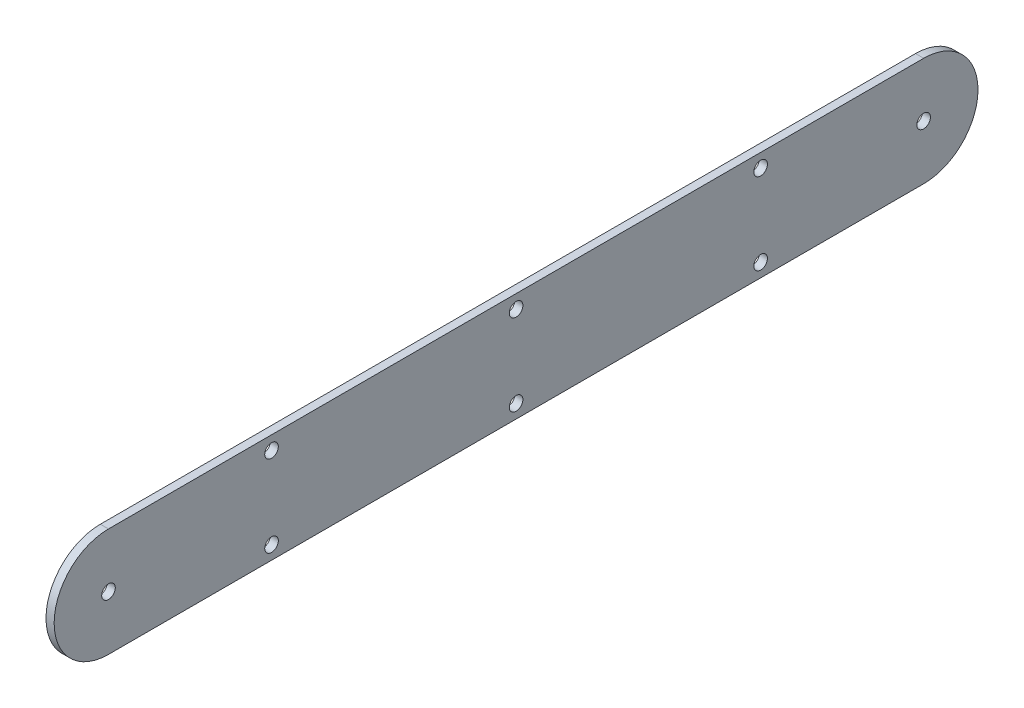
ISO-10303-21;
HEADER;
FILE_DESCRIPTION(('STEP AP214'),'2;1');
FILE_NAME('part.step','',(''),(''),'','','');
FILE_SCHEMA(('AUTOMOTIVE_DESIGN { 1 0 10303 214 1 1 1 1 }'));
ENDSEC;
DATA;
#1=APPLICATION_CONTEXT('core data for automotive mechanical design processes');
#2=APPLICATION_PROTOCOL_DEFINITION('international standard','automotive_design',2000,#1);
#3=PRODUCT_CONTEXT('',#1,'mechanical');
#4=PRODUCT('Part','Part','',(#3));
#5=PRODUCT_RELATED_PRODUCT_CATEGORY('part','',(#4));
#6=PRODUCT_DEFINITION_FORMATION('','',#4);
#7=PRODUCT_DEFINITION_CONTEXT('part definition',#1,'design');
#8=PRODUCT_DEFINITION('design','',#6,#7);
#9=PRODUCT_DEFINITION_SHAPE('','',#8);
#10=(LENGTH_UNIT() NAMED_UNIT(*) SI_UNIT(.MILLI.,.METRE.));
#11=(NAMED_UNIT(*) PLANE_ANGLE_UNIT() SI_UNIT($,.RADIAN.));
#12=(NAMED_UNIT(*) SI_UNIT($,.STERADIAN.) SOLID_ANGLE_UNIT());
#13=UNCERTAINTY_MEASURE_WITH_UNIT(LENGTH_MEASURE(1.E-05),#10,'distance_accuracy_value','');
#14=(GEOMETRIC_REPRESENTATION_CONTEXT(3) GLOBAL_UNCERTAINTY_ASSIGNED_CONTEXT((#13)) GLOBAL_UNIT_ASSIGNED_CONTEXT((#10,
#11,#12)) REPRESENTATION_CONTEXT('',''));
#15=CARTESIAN_POINT('',(0.,0.,0.));
#16=DIRECTION('',(0.,0.,1.));
#17=DIRECTION('',(1.,0.,0.));
#18=AXIS2_PLACEMENT_3D('',#15,#16,#17);
#19=CARTESIAN_POINT('',(3.,0.,-150.));
#20=DIRECTION('',(-1.,0.,0.));
#21=DIRECTION('',(0.,0.,1.));
#22=AXIS2_PLACEMENT_3D('',#19,#20,#21);
#23=PLANE('',#22);
#24=CARTESIAN_POINT('',(3.,15.,0.));
#25=DIRECTION('',(1.,0.,0.));
#26=DIRECTION('',(0.,0.,-1.));
#27=AXIS2_PLACEMENT_3D('',#24,#25,#26);
#28=CIRCLE('',#27,2.5);
#29=CARTESIAN_POINT('',(3.,15.,-2.5));
#30=VERTEX_POINT('',#29);
#31=EDGE_CURVE('E144',#30,#30,#28,.T.);
#32=ORIENTED_EDGE('',*,*,#31,.F.);
#33=EDGE_LOOP('',(#32));
#34=FACE_BOUND('',#33,.T.);
#35=CARTESIAN_POINT('',(3.,15.,90.));
#36=DIRECTION('',(1.,0.,0.));
#37=DIRECTION('',(0.,0.,-1.));
#38=AXIS2_PLACEMENT_3D('',#35,#36,#37);
#39=CIRCLE('',#38,2.49999999999999);
#40=CARTESIAN_POINT('',(3.,15.,87.5));
#41=VERTEX_POINT('',#40);
#42=EDGE_CURVE('E132',#41,#41,#39,.T.);
#43=ORIENTED_EDGE('',*,*,#42,.F.);
#44=EDGE_LOOP('',(#43));
#45=FACE_BOUND('',#44,.T.);
#46=CARTESIAN_POINT('',(3.,15.,-90.));
#47=DIRECTION('',(1.,0.,0.));
#48=DIRECTION('',(0.,0.,-1.));
#49=AXIS2_PLACEMENT_3D('',#46,#47,#48);
#50=CIRCLE('',#49,2.5);
#51=CARTESIAN_POINT('',(3.,15.,-92.5));
#52=VERTEX_POINT('',#51);
#53=EDGE_CURVE('E120',#52,#52,#50,.T.);
#54=ORIENTED_EDGE('',*,*,#53,.F.);
#55=EDGE_LOOP('',(#54));
#56=FACE_BOUND('',#55,.T.);
#57=CARTESIAN_POINT('',(3.,0.,-150.));
#58=DIRECTION('',(1.,0.,0.));
#59=DIRECTION('',(0.,0.,-1.));
#60=AXIS2_PLACEMENT_3D('',#57,#58,#59);
#61=CIRCLE('',#60,2.5);
#62=CARTESIAN_POINT('',(3.,0.,-152.5));
#63=VERTEX_POINT('',#62);
#64=EDGE_CURVE('E99',#63,#63,#61,.T.);
#65=ORIENTED_EDGE('',*,*,#64,.F.);
#66=EDGE_LOOP('',(#65));
#67=FACE_BOUND('',#66,.T.);
#68=CARTESIAN_POINT('',(3.,0.,-150.));
#69=DIRECTION('',(1.,0.,0.));
#70=DIRECTION('',(0.,0.,1.));
#71=AXIS2_PLACEMENT_3D('',#68,#69,#70);
#72=CIRCLE('',#71,20.);
#73=CARTESIAN_POINT('',(3.,-20.,-150.));
#74=VERTEX_POINT('',#73);
#75=CARTESIAN_POINT('',(3.,20.,-150.));
#76=VERTEX_POINT('',#75);
#77=EDGE_CURVE('E84',#74,#76,#72,.T.);
#78=ORIENTED_EDGE('',*,*,#77,.T.);
#79=DIRECTION('',(0.,0.,1.));
#80=VECTOR('',#79,1.);
#81=CARTESIAN_POINT('',(3.,20.,150.));
#82=LINE('',#81,#80);
#83=CARTESIAN_POINT('',(3.,20.,150.));
#84=VERTEX_POINT('',#83);
#85=EDGE_CURVE('E79',#76,#84,#82,.T.);
#86=ORIENTED_EDGE('',*,*,#85,.T.);
#87=CARTESIAN_POINT('',(3.,0.,150.));
#88=DIRECTION('',(1.,0.,0.));
#89=DIRECTION('',(0.,0.,-1.));
#90=AXIS2_PLACEMENT_3D('',#87,#88,#89);
#91=CIRCLE('',#90,20.);
#92=CARTESIAN_POINT('',(3.,-20.,150.));
#93=VERTEX_POINT('',#92);
#94=EDGE_CURVE('E82',#84,#93,#91,.T.);
#95=ORIENTED_EDGE('',*,*,#94,.T.);
#96=DIRECTION('',(0.,0.,-1.));
#97=VECTOR('',#96,1.);
#98=CARTESIAN_POINT('',(3.,-20.,150.));
#99=LINE('',#98,#97);
#100=EDGE_CURVE('E49',#93,#74,#99,.T.);
#101=ORIENTED_EDGE('',*,*,#100,.T.);
#102=EDGE_LOOP('',(#78,#86,#95,#101));
#103=FACE_BOUND('',#102,.T.);
#104=CARTESIAN_POINT('',(3.,0.,150.));
#105=DIRECTION('',(1.,0.,0.));
#106=DIRECTION('',(0.,0.,-1.));
#107=AXIS2_PLACEMENT_3D('',#104,#105,#106);
#108=CIRCLE('',#107,2.5);
#109=CARTESIAN_POINT('',(3.,0.,147.5));
#110=VERTEX_POINT('',#109);
#111=EDGE_CURVE('E114',#110,#110,#108,.T.);
#112=ORIENTED_EDGE('',*,*,#111,.F.);
#113=EDGE_LOOP('',(#112));
#114=FACE_BOUND('',#113,.T.);
#115=CARTESIAN_POINT('',(3.,-15.,-90.));
#116=DIRECTION('',(1.,0.,0.));
#117=DIRECTION('',(0.,0.,-1.));
#118=AXIS2_PLACEMENT_3D('',#115,#116,#117);
#119=CIRCLE('',#118,2.5);
#120=CARTESIAN_POINT('',(3.,-15.,-92.5));
#121=VERTEX_POINT('',#120);
#122=EDGE_CURVE('E126',#121,#121,#119,.T.);
#123=ORIENTED_EDGE('',*,*,#122,.F.);
#124=EDGE_LOOP('',(#123));
#125=FACE_BOUND('',#124,.T.);
#126=CARTESIAN_POINT('',(3.,-15.,90.));
#127=DIRECTION('',(1.,0.,0.));
#128=DIRECTION('',(0.,0.,-1.));
#129=AXIS2_PLACEMENT_3D('',#126,#127,#128);
#130=CIRCLE('',#129,2.49999999999999);
#131=CARTESIAN_POINT('',(3.,-15.,87.5));
#132=VERTEX_POINT('',#131);
#133=EDGE_CURVE('E138',#132,#132,#130,.T.);
#134=ORIENTED_EDGE('',*,*,#133,.F.);
#135=EDGE_LOOP('',(#134));
#136=FACE_BOUND('',#135,.T.);
#137=CARTESIAN_POINT('',(3.,-15.,0.));
#138=DIRECTION('',(1.,0.,0.));
#139=DIRECTION('',(0.,0.,-1.));
#140=AXIS2_PLACEMENT_3D('',#137,#138,#139);
#141=CIRCLE('',#140,2.5);
#142=CARTESIAN_POINT('',(3.,-15.,-2.5));
#143=VERTEX_POINT('',#142);
#144=EDGE_CURVE('E150',#143,#143,#141,.T.);
#145=ORIENTED_EDGE('',*,*,#144,.F.);
#146=EDGE_LOOP('',(#145));
#147=FACE_BOUND('',#146,.T.);
#148=ADVANCED_FACE('F32',(#34,#45,#56,#67,#103,#114,#125,#136,#147),#23,.F.);
#149=CARTESIAN_POINT('',(0.,0.,-150.));
#150=DIRECTION('',(-1.,0.,0.));
#151=DIRECTION('',(0.,0.,1.));
#152=AXIS2_PLACEMENT_3D('',#149,#150,#151);
#153=PLANE('',#152);
#154=CARTESIAN_POINT('',(0.,15.,0.));
#155=DIRECTION('',(1.,0.,0.));
#156=DIRECTION('',(0.,0.,-1.));
#157=AXIS2_PLACEMENT_3D('',#154,#155,#156);
#158=CIRCLE('',#157,2.5);
#159=CARTESIAN_POINT('',(0.,15.,-2.5));
#160=VERTEX_POINT('',#159);
#161=EDGE_CURVE('E147',#160,#160,#158,.T.);
#162=ORIENTED_EDGE('',*,*,#161,.T.);
#163=EDGE_LOOP('',(#162));
#164=FACE_BOUND('',#163,.T.);
#165=CARTESIAN_POINT('',(0.,15.,90.));
#166=DIRECTION('',(1.,0.,0.));
#167=DIRECTION('',(0.,0.,-1.));
#168=AXIS2_PLACEMENT_3D('',#165,#166,#167);
#169=CIRCLE('',#168,2.49999999999999);
#170=CARTESIAN_POINT('',(0.,15.,87.5));
#171=VERTEX_POINT('',#170);
#172=EDGE_CURVE('E135',#171,#171,#169,.T.);
#173=ORIENTED_EDGE('',*,*,#172,.T.);
#174=EDGE_LOOP('',(#173));
#175=FACE_BOUND('',#174,.T.);
#176=CARTESIAN_POINT('',(0.,15.,-90.));
#177=DIRECTION('',(1.,0.,0.));
#178=DIRECTION('',(0.,0.,-1.));
#179=AXIS2_PLACEMENT_3D('',#176,#177,#178);
#180=CIRCLE('',#179,2.5);
#181=CARTESIAN_POINT('',(0.,15.,-92.5));
#182=VERTEX_POINT('',#181);
#183=EDGE_CURVE('E123',#182,#182,#180,.T.);
#184=ORIENTED_EDGE('',*,*,#183,.T.);
#185=EDGE_LOOP('',(#184));
#186=FACE_BOUND('',#185,.T.);
#187=CARTESIAN_POINT('',(0.,0.,-150.));
#188=DIRECTION('',(1.,0.,0.));
#189=DIRECTION('',(0.,0.,-1.));
#190=AXIS2_PLACEMENT_3D('',#187,#188,#189);
#191=CIRCLE('',#190,2.5);
#192=CARTESIAN_POINT('',(0.,0.,-152.5));
#193=VERTEX_POINT('',#192);
#194=EDGE_CURVE('E111',#193,#193,#191,.T.);
#195=ORIENTED_EDGE('',*,*,#194,.T.);
#196=EDGE_LOOP('',(#195));
#197=FACE_BOUND('',#196,.T.);
#198=CARTESIAN_POINT('',(0.,0.,-150.));
#199=DIRECTION('',(1.,0.,0.));
#200=DIRECTION('',(0.,0.,1.));
#201=AXIS2_PLACEMENT_3D('',#198,#199,#200);
#202=CIRCLE('',#201,20.);
#203=CARTESIAN_POINT('',(0.,-20.,-150.));
#204=VERTEX_POINT('',#203);
#205=CARTESIAN_POINT('',(0.,20.,-150.));
#206=VERTEX_POINT('',#205);
#207=EDGE_CURVE('E96',#204,#206,#202,.T.);
#208=ORIENTED_EDGE('',*,*,#207,.F.);
#209=DIRECTION('',(0.,0.,-1.));
#210=VECTOR('',#209,1.);
#211=CARTESIAN_POINT('',(0.,-20.,150.));
#212=LINE('',#211,#210);
#213=CARTESIAN_POINT('',(0.,-20.,150.));
#214=VERTEX_POINT('',#213);
#215=EDGE_CURVE('E72',#214,#204,#212,.T.);
#216=ORIENTED_EDGE('',*,*,#215,.F.);
#217=CARTESIAN_POINT('',(0.,0.,150.));
#218=DIRECTION('',(1.,0.,0.));
#219=DIRECTION('',(0.,0.,-1.));
#220=AXIS2_PLACEMENT_3D('',#217,#218,#219);
#221=CIRCLE('',#220,20.);
#222=CARTESIAN_POINT('',(0.,20.,150.));
#223=VERTEX_POINT('',#222);
#224=EDGE_CURVE('E66',#223,#214,#221,.T.);
#225=ORIENTED_EDGE('',*,*,#224,.F.);
#226=DIRECTION('',(0.,0.,1.));
#227=VECTOR('',#226,1.);
#228=CARTESIAN_POINT('',(0.,20.,150.));
#229=LINE('',#228,#227);
#230=EDGE_CURVE('E88',#206,#223,#229,.T.);
#231=ORIENTED_EDGE('',*,*,#230,.F.);
#232=EDGE_LOOP('',(#208,#216,#225,#231));
#233=FACE_BOUND('',#232,.T.);
#234=CARTESIAN_POINT('',(0.,0.,150.));
#235=DIRECTION('',(1.,0.,0.));
#236=DIRECTION('',(0.,0.,-1.));
#237=AXIS2_PLACEMENT_3D('',#234,#235,#236);
#238=CIRCLE('',#237,2.5);
#239=CARTESIAN_POINT('',(0.,0.,147.5));
#240=VERTEX_POINT('',#239);
#241=EDGE_CURVE('E117',#240,#240,#238,.T.);
#242=ORIENTED_EDGE('',*,*,#241,.T.);
#243=EDGE_LOOP('',(#242));
#244=FACE_BOUND('',#243,.T.);
#245=CARTESIAN_POINT('',(0.,-15.,-90.));
#246=DIRECTION('',(1.,0.,0.));
#247=DIRECTION('',(0.,0.,-1.));
#248=AXIS2_PLACEMENT_3D('',#245,#246,#247);
#249=CIRCLE('',#248,2.5);
#250=CARTESIAN_POINT('',(0.,-15.,-92.5));
#251=VERTEX_POINT('',#250);
#252=EDGE_CURVE('E129',#251,#251,#249,.T.);
#253=ORIENTED_EDGE('',*,*,#252,.T.);
#254=EDGE_LOOP('',(#253));
#255=FACE_BOUND('',#254,.T.);
#256=CARTESIAN_POINT('',(0.,-15.,90.));
#257=DIRECTION('',(1.,0.,0.));
#258=DIRECTION('',(0.,0.,-1.));
#259=AXIS2_PLACEMENT_3D('',#256,#257,#258);
#260=CIRCLE('',#259,2.49999999999999);
#261=CARTESIAN_POINT('',(0.,-15.,87.5));
#262=VERTEX_POINT('',#261);
#263=EDGE_CURVE('E141',#262,#262,#260,.T.);
#264=ORIENTED_EDGE('',*,*,#263,.T.);
#265=EDGE_LOOP('',(#264));
#266=FACE_BOUND('',#265,.T.);
#267=CARTESIAN_POINT('',(0.,-15.,0.));
#268=DIRECTION('',(1.,0.,0.));
#269=DIRECTION('',(0.,0.,-1.));
#270=AXIS2_PLACEMENT_3D('',#267,#268,#269);
#271=CIRCLE('',#270,2.5);
#272=CARTESIAN_POINT('',(0.,-15.,-2.5));
#273=VERTEX_POINT('',#272);
#274=EDGE_CURVE('E153',#273,#273,#271,.T.);
#275=ORIENTED_EDGE('',*,*,#274,.T.);
#276=EDGE_LOOP('',(#275));
#277=FACE_BOUND('',#276,.T.);
#278=ADVANCED_FACE('F107',(#164,#175,#186,#197,#233,#244,#255,#266,#277),#153,.T.);
#279=CARTESIAN_POINT('',(3.,0.,-150.));
#280=DIRECTION('',(-1.,0.,0.));
#281=DIRECTION('',(0.,0.,1.));
#282=AXIS2_PLACEMENT_3D('',#279,#280,#281);
#283=CYLINDRICAL_SURFACE('',#282,20.);
#284=ORIENTED_EDGE('',*,*,#207,.T.);
#285=DIRECTION('',(-1.,0.,0.));
#286=VECTOR('',#285,1.);
#287=CARTESIAN_POINT('',(3.,20.,-150.));
#288=LINE('',#287,#286);
#289=EDGE_CURVE('E11',#76,#206,#288,.T.);
#290=ORIENTED_EDGE('',*,*,#289,.F.);
#291=ORIENTED_EDGE('',*,*,#77,.F.);
#292=DIRECTION('',(-1.,0.,0.));
#293=VECTOR('',#292,1.);
#294=CARTESIAN_POINT('',(3.,-20.,-150.));
#295=LINE('',#294,#293);
#296=EDGE_CURVE('E92',#74,#204,#295,.T.);
#297=ORIENTED_EDGE('',*,*,#296,.T.);
#298=EDGE_LOOP('',(#284,#290,#291,#297));
#299=FACE_BOUND('',#298,.T.);
#300=ADVANCED_FACE('F34',(#299),#283,.T.);
#301=CARTESIAN_POINT('',(3.,20.,150.));
#302=DIRECTION('',(0.,-1.,0.));
#303=DIRECTION('',(0.,0.,-1.));
#304=AXIS2_PLACEMENT_3D('',#301,#302,#303);
#305=PLANE('',#304);
#306=ORIENTED_EDGE('',*,*,#230,.T.);
#307=DIRECTION('',(-1.,0.,0.));
#308=VECTOR('',#307,1.);
#309=CARTESIAN_POINT('',(3.,20.,150.));
#310=LINE('',#309,#308);
#311=EDGE_CURVE('E41',#84,#223,#310,.T.);
#312=ORIENTED_EDGE('',*,*,#311,.F.);
#313=ORIENTED_EDGE('',*,*,#85,.F.);
#314=ORIENTED_EDGE('',*,*,#289,.T.);
#315=EDGE_LOOP('',(#306,#312,#313,#314));
#316=FACE_BOUND('',#315,.T.);
#317=ADVANCED_FACE('F87',(#316),#305,.F.);
#318=CARTESIAN_POINT('',(3.,0.,150.));
#319=DIRECTION('',(-1.,0.,0.));
#320=DIRECTION('',(0.,0.,1.));
#321=AXIS2_PLACEMENT_3D('',#318,#319,#320);
#322=CYLINDRICAL_SURFACE('',#321,20.);
#323=ORIENTED_EDGE('',*,*,#224,.T.);
#324=DIRECTION('',(-1.,0.,0.));
#325=VECTOR('',#324,1.);
#326=CARTESIAN_POINT('',(3.,-20.,150.));
#327=LINE('',#326,#325);
#328=EDGE_CURVE('E89',#93,#214,#327,.T.);
#329=ORIENTED_EDGE('',*,*,#328,.F.);
#330=ORIENTED_EDGE('',*,*,#94,.F.);
#331=ORIENTED_EDGE('',*,*,#311,.T.);
#332=EDGE_LOOP('',(#323,#329,#330,#331));
#333=FACE_BOUND('',#332,.T.);
#334=ADVANCED_FACE('F90',(#333),#322,.T.);
#335=CARTESIAN_POINT('',(3.,-20.,150.));
#336=DIRECTION('',(0.,1.,0.));
#337=DIRECTION('',(0.,0.,1.));
#338=AXIS2_PLACEMENT_3D('',#335,#336,#337);
#339=PLANE('',#338);
#340=ORIENTED_EDGE('',*,*,#215,.T.);
#341=ORIENTED_EDGE('',*,*,#296,.F.);
#342=ORIENTED_EDGE('',*,*,#100,.F.);
#343=ORIENTED_EDGE('',*,*,#328,.T.);
#344=EDGE_LOOP('',(#340,#341,#342,#343));
#345=FACE_BOUND('',#344,.T.);
#346=ADVANCED_FACE('F104',(#345),#339,.F.);
#347=CARTESIAN_POINT('',(3.,0.,-150.));
#348=DIRECTION('',(-1.,0.,0.));
#349=DIRECTION('',(0.,0.,1.));
#350=AXIS2_PLACEMENT_3D('',#347,#348,#349);
#351=CYLINDRICAL_SURFACE('',#350,2.5);
#352=ORIENTED_EDGE('',*,*,#64,.T.);
#353=EDGE_LOOP('',(#352));
#354=FACE_BOUND('',#353,.T.);
#355=ORIENTED_EDGE('',*,*,#194,.F.);
#356=EDGE_LOOP('',(#355));
#357=FACE_BOUND('',#356,.T.);
#358=ADVANCED_FACE('F173',(#354,#357),#351,.F.);
#359=CARTESIAN_POINT('',(3.,0.,150.));
#360=DIRECTION('',(-1.,0.,0.));
#361=DIRECTION('',(0.,0.,1.));
#362=AXIS2_PLACEMENT_3D('',#359,#360,#361);
#363=CYLINDRICAL_SURFACE('',#362,2.5);
#364=ORIENTED_EDGE('',*,*,#111,.T.);
#365=EDGE_LOOP('',(#364));
#366=FACE_BOUND('',#365,.T.);
#367=ORIENTED_EDGE('',*,*,#241,.F.);
#368=EDGE_LOOP('',(#367));
#369=FACE_BOUND('',#368,.T.);
#370=ADVANCED_FACE('F219',(#366,#369),#363,.F.);
#371=CARTESIAN_POINT('',(3.,15.,-90.));
#372=DIRECTION('',(-1.,0.,0.));
#373=DIRECTION('',(0.,0.,1.));
#374=AXIS2_PLACEMENT_3D('',#371,#372,#373);
#375=CYLINDRICAL_SURFACE('',#374,2.5);
#376=ORIENTED_EDGE('',*,*,#53,.T.);
#377=EDGE_LOOP('',(#376));
#378=FACE_BOUND('',#377,.T.);
#379=ORIENTED_EDGE('',*,*,#183,.F.);
#380=EDGE_LOOP('',(#379));
#381=FACE_BOUND('',#380,.T.);
#382=ADVANCED_FACE('F227',(#378,#381),#375,.F.);
#383=CARTESIAN_POINT('',(3.,-15.,-90.));
#384=DIRECTION('',(-1.,0.,0.));
#385=DIRECTION('',(0.,0.,1.));
#386=AXIS2_PLACEMENT_3D('',#383,#384,#385);
#387=CYLINDRICAL_SURFACE('',#386,2.5);
#388=ORIENTED_EDGE('',*,*,#122,.T.);
#389=EDGE_LOOP('',(#388));
#390=FACE_BOUND('',#389,.T.);
#391=ORIENTED_EDGE('',*,*,#252,.F.);
#392=EDGE_LOOP('',(#391));
#393=FACE_BOUND('',#392,.T.);
#394=ADVANCED_FACE('F235',(#390,#393),#387,.F.);
#395=CARTESIAN_POINT('',(3.,15.,90.));
#396=DIRECTION('',(-1.,0.,0.));
#397=DIRECTION('',(0.,0.,1.));
#398=AXIS2_PLACEMENT_3D('',#395,#396,#397);
#399=CYLINDRICAL_SURFACE('',#398,2.49999999999999);
#400=ORIENTED_EDGE('',*,*,#42,.T.);
#401=EDGE_LOOP('',(#400));
#402=FACE_BOUND('',#401,.T.);
#403=ORIENTED_EDGE('',*,*,#172,.F.);
#404=EDGE_LOOP('',(#403));
#405=FACE_BOUND('',#404,.T.);
#406=ADVANCED_FACE('F244',(#402,#405),#399,.F.);
#407=CARTESIAN_POINT('',(3.,-15.,90.));
#408=DIRECTION('',(-1.,0.,0.));
#409=DIRECTION('',(0.,0.,1.));
#410=AXIS2_PLACEMENT_3D('',#407,#408,#409);
#411=CYLINDRICAL_SURFACE('',#410,2.49999999999999);
#412=ORIENTED_EDGE('',*,*,#133,.T.);
#413=EDGE_LOOP('',(#412));
#414=FACE_BOUND('',#413,.T.);
#415=ORIENTED_EDGE('',*,*,#263,.F.);
#416=EDGE_LOOP('',(#415));
#417=FACE_BOUND('',#416,.T.);
#418=ADVANCED_FACE('F253',(#414,#417),#411,.F.);
#419=CARTESIAN_POINT('',(3.,15.,0.));
#420=DIRECTION('',(-1.,0.,0.));
#421=DIRECTION('',(0.,0.,1.));
#422=AXIS2_PLACEMENT_3D('',#419,#420,#421);
#423=CYLINDRICAL_SURFACE('',#422,2.5);
#424=ORIENTED_EDGE('',*,*,#31,.T.);
#425=EDGE_LOOP('',(#424));
#426=FACE_BOUND('',#425,.T.);
#427=ORIENTED_EDGE('',*,*,#161,.F.);
#428=EDGE_LOOP('',(#427));
#429=FACE_BOUND('',#428,.T.);
#430=ADVANCED_FACE('F262',(#426,#429),#423,.F.);
#431=CARTESIAN_POINT('',(3.,-15.,0.));
#432=DIRECTION('',(-1.,0.,0.));
#433=DIRECTION('',(0.,0.,1.));
#434=AXIS2_PLACEMENT_3D('',#431,#432,#433);
#435=CYLINDRICAL_SURFACE('',#434,2.5);
#436=ORIENTED_EDGE('',*,*,#144,.T.);
#437=EDGE_LOOP('',(#436));
#438=FACE_BOUND('',#437,.T.);
#439=ORIENTED_EDGE('',*,*,#274,.F.);
#440=EDGE_LOOP('',(#439));
#441=FACE_BOUND('',#440,.T.);
#442=ADVANCED_FACE('F159',(#438,#441),#435,.F.);
#443=CLOSED_SHELL('',(#148,#278,#300,#317,#334,#346,#358,#370,#382,#394,#406,#418,#430,#442));
#444=MANIFOLD_SOLID_BREP('B2',#443);
#445=ADVANCED_BREP_SHAPE_REPRESENTATION('',(#18,#444),#14);
#446=SHAPE_DEFINITION_REPRESENTATION(#9,#445);
ENDSEC;
END-ISO-10303-21;
